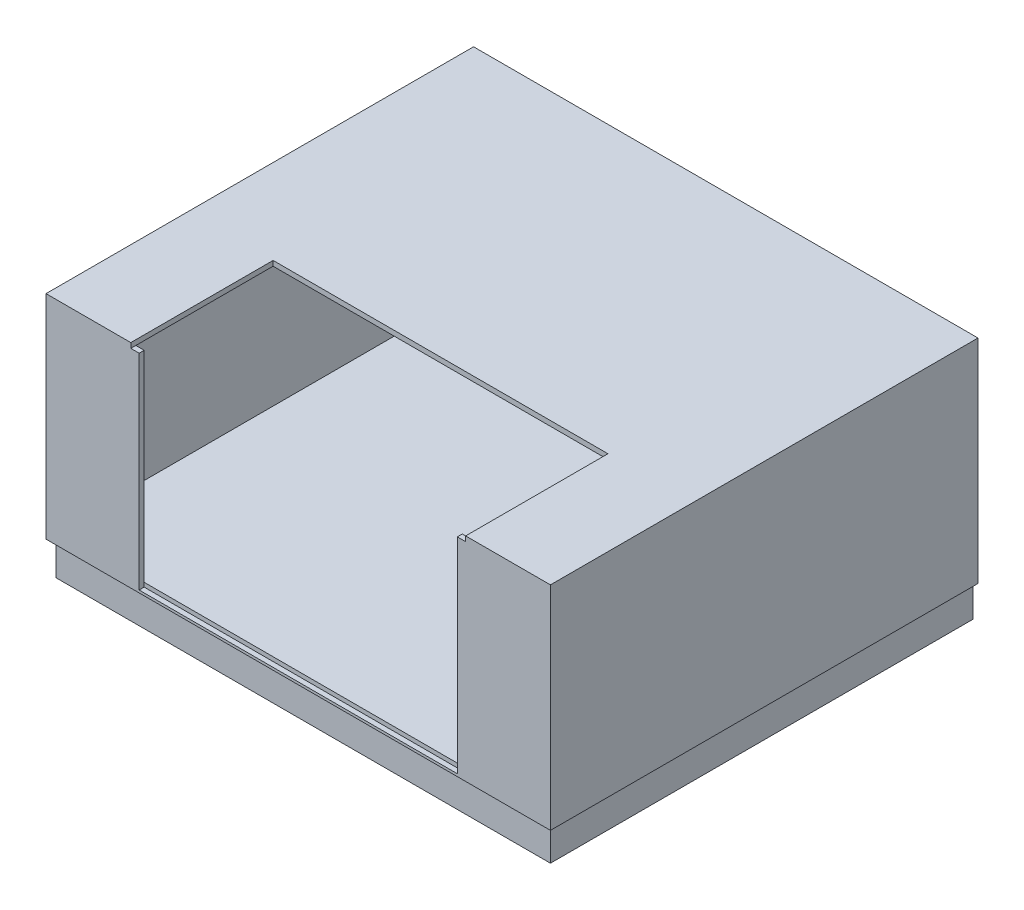
ISO-10303-21;
HEADER;
FILE_DESCRIPTION(('STEP AP214'),'2;1');
FILE_NAME('part.step','',(''),(''),'','','');
FILE_SCHEMA(('AUTOMOTIVE_DESIGN { 1 0 10303 214 1 1 1 1 }'));
ENDSEC;
DATA;
#1=APPLICATION_CONTEXT('core data for automotive mechanical design processes');
#2=APPLICATION_PROTOCOL_DEFINITION('international standard','automotive_design',2000,#1);
#3=PRODUCT_CONTEXT('',#1,'mechanical');
#4=PRODUCT('Part','Part','',(#3));
#5=PRODUCT_RELATED_PRODUCT_CATEGORY('part','',(#4));
#6=PRODUCT_DEFINITION_FORMATION('','',#4);
#7=PRODUCT_DEFINITION_CONTEXT('part definition',#1,'design');
#8=PRODUCT_DEFINITION('design','',#6,#7);
#9=PRODUCT_DEFINITION_SHAPE('','',#8);
#10=(LENGTH_UNIT() NAMED_UNIT(*) SI_UNIT(.MILLI.,.METRE.));
#11=(NAMED_UNIT(*) PLANE_ANGLE_UNIT() SI_UNIT($,.RADIAN.));
#12=(NAMED_UNIT(*) SI_UNIT($,.STERADIAN.) SOLID_ANGLE_UNIT());
#13=UNCERTAINTY_MEASURE_WITH_UNIT(LENGTH_MEASURE(1.E-05),#10,'distance_accuracy_value','');
#14=(GEOMETRIC_REPRESENTATION_CONTEXT(3) GLOBAL_UNCERTAINTY_ASSIGNED_CONTEXT((#13)) GLOBAL_UNIT_ASSIGNED_CONTEXT((#10,
#11,#12)) REPRESENTATION_CONTEXT('',''));
#15=CARTESIAN_POINT('',(0.,0.,0.));
#16=DIRECTION('',(0.,0.,1.));
#17=DIRECTION('',(1.,0.,0.));
#18=AXIS2_PLACEMENT_3D('',#15,#16,#17);
#19=CARTESIAN_POINT('',(0.,0.,0.));
#20=DIRECTION('',(0.,1.,0.));
#21=DIRECTION('',(0.,0.,1.));
#22=AXIS2_PLACEMENT_3D('',#19,#20,#21);
#23=PLANE('',#22);
#24=DIRECTION('',(0.,0.,-1.));
#25=VECTOR('',#24,1.);
#26=CARTESIAN_POINT('',(4.71276856657332,0.,573.910779329399));
#27=LINE('',#26,#25);
#28=CARTESIAN_POINT('',(4.71276856657332,0.,573.910779329399));
#29=VERTEX_POINT('',#28);
#30=CARTESIAN_POINT('',(4.71276856657335,0.,69.1490048236985));
#31=VERTEX_POINT('',#30);
#32=EDGE_CURVE('E50',#29,#31,#27,.T.);
#33=ORIENTED_EDGE('',*,*,#32,.F.);
#34=DIRECTION('',(-1.,0.,0.));
#35=VECTOR('',#34,1.);
#36=CARTESIAN_POINT('',(4.71276856657332,0.,573.910779329399));
#37=LINE('',#36,#35);
#38=CARTESIAN_POINT('',(595.287231433427,0.,573.910779329399));
#39=VERTEX_POINT('',#38);
#40=EDGE_CURVE('E54',#39,#29,#37,.T.);
#41=ORIENTED_EDGE('',*,*,#40,.F.);
#42=DIRECTION('',(0.,0.,1.));
#43=VECTOR('',#42,1.);
#44=CARTESIAN_POINT('',(595.287231433427,0.,573.910779329399));
#45=LINE('',#44,#43);
#46=CARTESIAN_POINT('',(595.287231433427,0.,69.1490048236985));
#47=VERTEX_POINT('',#46);
#48=EDGE_CURVE('E385',#47,#39,#45,.T.);
#49=ORIENTED_EDGE('',*,*,#48,.F.);
#50=DIRECTION('',(-1.,0.,0.));
#51=VECTOR('',#50,1.);
#52=CARTESIAN_POINT('',(-1.28723143342668,0.,69.1490048236985));
#53=LINE('',#52,#51);
#54=CARTESIAN_POINT('',(601.287231433427,0.,69.1490048236985));
#55=VERTEX_POINT('',#54);
#56=EDGE_CURVE('E361',#55,#47,#53,.T.);
#57=ORIENTED_EDGE('',*,*,#56,.F.);
#58=DIRECTION('',(0.,0.,-1.));
#59=VECTOR('',#58,1.);
#60=CARTESIAN_POINT('',(601.287231433427,0.,69.1490048236985));
#61=LINE('',#60,#59);
#62=CARTESIAN_POINT('',(601.287231433427,0.,579.910779329399));
#63=VERTEX_POINT('',#62);
#64=EDGE_CURVE('E358',#63,#55,#61,.T.);
#65=ORIENTED_EDGE('',*,*,#64,.F.);
#66=DIRECTION('',(1.,0.,0.));
#67=VECTOR('',#66,1.);
#68=CARTESIAN_POINT('',(-1.28723143342668,0.,579.910779329399));
#69=LINE('',#68,#67);
#70=CARTESIAN_POINT('',(-1.28723143342668,0.,579.910779329399));
#71=VERTEX_POINT('',#70);
#72=EDGE_CURVE('E301',#71,#63,#69,.T.);
#73=ORIENTED_EDGE('',*,*,#72,.F.);
#74=DIRECTION('',(0.,0.,1.));
#75=VECTOR('',#74,1.);
#76=CARTESIAN_POINT('',(-1.28723143342668,0.,69.1490048236985));
#77=LINE('',#76,#75);
#78=CARTESIAN_POINT('',(-1.28723143342668,0.,69.1490048236985));
#79=VERTEX_POINT('',#78);
#80=EDGE_CURVE('E350',#79,#71,#77,.T.);
#81=ORIENTED_EDGE('',*,*,#80,.F.);
#82=EDGE_CURVE('E360',#31,#79,#53,.T.);
#83=ORIENTED_EDGE('',*,*,#82,.F.);
#84=EDGE_LOOP('',(#33,#41,#49,#57,#65,#73,#81,#83));
#85=FACE_BOUND('',#84,.T.);
#86=ADVANCED_FACE('F35',(#85),#23,.F.);
#87=DIRECTION('',(0.,0.,-1.));
#88=VECTOR('',#87,1.);
#89=CARTESIAN_POINT('',(555.287231433427,0.,69.1490048236985));
#90=LINE('',#89,#88);
#91=CARTESIAN_POINT('',(555.287231433427,0.,533.910779329399));
#92=VERTEX_POINT('',#91);
#93=CARTESIAN_POINT('',(555.287231433427,0.,69.1490048236985));
#94=VERTEX_POINT('',#93);
#95=EDGE_CURVE('E389',#92,#94,#90,.T.);
#96=ORIENTED_EDGE('',*,*,#95,.F.);
#97=DIRECTION('',(1.,0.,0.));
#98=VECTOR('',#97,1.);
#99=CARTESIAN_POINT('',(555.287231433427,0.,533.910779329399));
#100=LINE('',#99,#98);
#101=CARTESIAN_POINT('',(44.7127685665733,0.,533.910779329399));
#102=VERTEX_POINT('',#101);
#103=EDGE_CURVE('E393',#102,#92,#100,.T.);
#104=ORIENTED_EDGE('',*,*,#103,.F.);
#105=DIRECTION('',(0.,0.,1.));
#106=VECTOR('',#105,1.);
#107=CARTESIAN_POINT('',(44.7127685665733,0.,533.910779329399));
#108=LINE('',#107,#106);
#109=CARTESIAN_POINT('',(44.7127685665734,0.,69.1490048236985));
#110=VERTEX_POINT('',#109);
#111=EDGE_CURVE('E419',#110,#102,#108,.T.);
#112=ORIENTED_EDGE('',*,*,#111,.F.);
#113=EDGE_CURVE('E363',#94,#110,#53,.T.);
#114=ORIENTED_EDGE('',*,*,#113,.F.);
#115=EDGE_LOOP('',(#96,#104,#112,#114));
#116=FACE_BOUND('',#115,.T.);
#117=ADVANCED_FACE('F450',(#116),#23,.F.);
#118=CARTESIAN_POINT('',(0.,0.,573.910779329399));
#119=DIRECTION('',(0.,0.,1.));
#120=DIRECTION('',(1.,0.,0.));
#121=AXIS2_PLACEMENT_3D('',#118,#119,#120);
#122=PLANE('',#121);
#123=DIRECTION('',(-1.,0.,0.));
#124=VECTOR('',#123,1.);
#125=CARTESIAN_POINT('',(0.,248.,573.910779329399));
#126=LINE('',#125,#124);
#127=CARTESIAN_POINT('',(110.,248.,573.910779329399));
#128=VERTEX_POINT('',#127);
#129=CARTESIAN_POINT('',(100.,248.,573.910779329399));
#130=VERTEX_POINT('',#129);
#131=EDGE_CURVE('E294',#128,#130,#126,.T.);
#132=ORIENTED_EDGE('',*,*,#131,.F.);
#133=DIRECTION('',(0.,1.,0.));
#134=VECTOR('',#133,1.);
#135=CARTESIAN_POINT('',(110.,248.,573.910779329399));
#136=LINE('',#135,#134);
#137=CARTESIAN_POINT('',(110.,8.00000000000001,573.910779329399));
#138=VERTEX_POINT('',#137);
#139=EDGE_CURVE('E241',#138,#128,#136,.T.);
#140=ORIENTED_EDGE('',*,*,#139,.F.);
#141=DIRECTION('',(1.,0.,0.));
#142=VECTOR('',#141,1.);
#143=CARTESIAN_POINT('',(-1.28723143342663,8.,573.910779329399));
#144=LINE('',#143,#142);
#145=CARTESIAN_POINT('',(4.71276856657335,8.,573.910779329399));
#146=VERTEX_POINT('',#145);
#147=EDGE_CURVE('E351',#146,#138,#144,.T.);
#148=ORIENTED_EDGE('',*,*,#147,.F.);
#149=DIRECTION('',(0.,-1.,0.));
#150=VECTOR('',#149,1.);
#151=CARTESIAN_POINT('',(4.71276856657338,248.,573.910779329399));
#152=LINE('',#151,#150);
#153=CARTESIAN_POINT('',(4.71276856657338,248.,573.910779329399));
#154=VERTEX_POINT('',#153);
#155=EDGE_CURVE('E347',#154,#146,#152,.T.);
#156=ORIENTED_EDGE('',*,*,#155,.F.);
#157=DIRECTION('',(1.,0.,0.));
#158=VECTOR('',#157,1.);
#159=CARTESIAN_POINT('',(-1.28723143342668,248.,573.910779329399));
#160=LINE('',#159,#158);
#161=EDGE_CURVE('E323',#154,#130,#160,.T.);
#162=ORIENTED_EDGE('',*,*,#161,.T.);
#163=EDGE_LOOP('',(#132,#140,#148,#156,#162));
#164=FACE_BOUND('',#163,.T.);
#165=ADVANCED_FACE('F456',(#164),#122,.F.);
#166=CARTESIAN_POINT('',(0.,248.,0.));
#167=DIRECTION('',(0.,1.,0.));
#168=DIRECTION('',(0.,0.,1.));
#169=AXIS2_PLACEMENT_3D('',#166,#167,#168);
#170=PLANE('',#169);
#171=DIRECTION('',(0.,0.,1.));
#172=VECTOR('',#171,1.);
#173=CARTESIAN_POINT('',(110.,248.,121.776949584267));
#174=LINE('',#173,#172);
#175=CARTESIAN_POINT('',(110.,248.,579.910779329399));
#176=VERTEX_POINT('',#175);
#177=EDGE_CURVE('E252',#128,#176,#174,.T.);
#178=ORIENTED_EDGE('',*,*,#177,.F.);
#179=ORIENTED_EDGE('',*,*,#131,.T.);
#180=DIRECTION('',(0.,0.,-1.));
#181=VECTOR('',#180,1.);
#182=CARTESIAN_POINT('',(100.,248.,579.910779329399));
#183=LINE('',#182,#181);
#184=CARTESIAN_POINT('',(100.,248.,579.910779329399));
#185=VERTEX_POINT('',#184);
#186=EDGE_CURVE('E269',#185,#130,#183,.T.);
#187=ORIENTED_EDGE('',*,*,#186,.F.);
#188=DIRECTION('',(-1.,0.,0.));
#189=VECTOR('',#188,1.);
#190=CARTESIAN_POINT('',(100.,248.,579.910779329399));
#191=LINE('',#190,#189);
#192=EDGE_CURVE('E272',#176,#185,#191,.T.);
#193=ORIENTED_EDGE('',*,*,#192,.F.);
#194=EDGE_LOOP('',(#178,#179,#187,#193));
#195=FACE_BOUND('',#194,.T.);
#196=ADVANCED_FACE('F507',(#195),#170,.T.);
#197=CARTESIAN_POINT('',(0.,8.,0.));
#198=DIRECTION('',(0.,1.,0.));
#199=DIRECTION('',(0.,0.,1.));
#200=AXIS2_PLACEMENT_3D('',#197,#198,#199);
#201=PLANE('',#200);
#202=ORIENTED_EDGE('',*,*,#147,.T.);
#203=DIRECTION('',(1.,0.,0.));
#204=VECTOR('',#203,1.);
#205=CARTESIAN_POINT('',(0.,8.,573.910779329399));
#206=LINE('',#205,#204);
#207=CARTESIAN_POINT('',(490.,8.00000000000001,573.910779329399));
#208=VERTEX_POINT('',#207);
#209=EDGE_CURVE('E261',#138,#208,#206,.T.);
#210=ORIENTED_EDGE('',*,*,#209,.T.);
#211=CARTESIAN_POINT('',(595.287231433427,8.,573.910779329399));
#212=VERTEX_POINT('',#211);
#213=EDGE_CURVE('E355',#208,#212,#144,.T.);
#214=ORIENTED_EDGE('',*,*,#213,.T.);
#215=DIRECTION('',(0.,0.,1.));
#216=VECTOR('',#215,1.);
#217=CARTESIAN_POINT('',(595.287231433427,8.,573.910779329399));
#218=LINE('',#217,#216);
#219=CARTESIAN_POINT('',(595.287231433427,8.,69.1490048236985));
#220=VERTEX_POINT('',#219);
#221=EDGE_CURVE('E322',#220,#212,#218,.T.);
#222=ORIENTED_EDGE('',*,*,#221,.F.);
#223=DIRECTION('',(-1.,0.,0.));
#224=VECTOR('',#223,1.);
#225=CARTESIAN_POINT('',(-1.28723143342668,8.,69.1490048236985));
#226=LINE('',#225,#224);
#227=CARTESIAN_POINT('',(4.71276856657331,8.,69.1490048236985));
#228=VERTEX_POINT('',#227);
#229=EDGE_CURVE('E354',#220,#228,#226,.T.);
#230=ORIENTED_EDGE('',*,*,#229,.T.);
#231=DIRECTION('',(0.,0.,-1.));
#232=VECTOR('',#231,1.);
#233=CARTESIAN_POINT('',(4.71276856657331,8.,69.1490048236985));
#234=LINE('',#233,#232);
#235=EDGE_CURVE('E338',#146,#228,#234,.T.);
#236=ORIENTED_EDGE('',*,*,#235,.F.);
#237=EDGE_LOOP('',(#202,#210,#214,#222,#230,#236));
#238=FACE_BOUND('',#237,.T.);
#239=ADVANCED_FACE('F459',(#238),#201,.T.);
#240=CARTESIAN_POINT('',(-1.28723143342668,8.,69.1490048236985));
#241=DIRECTION('',(1.,0.,0.));
#242=DIRECTION('',(0.,0.,-1.));
#243=AXIS2_PLACEMENT_3D('',#240,#241,#242);
#244=PLANE('',#243);
#245=ORIENTED_EDGE('',*,*,#80,.T.);
#246=DIRECTION('',(0.,-1.,0.));
#247=VECTOR('',#246,1.);
#248=CARTESIAN_POINT('',(-1.28723143342668,254.,579.910779329399));
#249=LINE('',#248,#247);
#250=CARTESIAN_POINT('',(-1.28723143342668,254.,579.910779329399));
#251=VERTEX_POINT('',#250);
#252=EDGE_CURVE('E298',#251,#71,#249,.T.);
#253=ORIENTED_EDGE('',*,*,#252,.F.);
#254=DIRECTION('',(0.,0.,1.));
#255=VECTOR('',#254,1.);
#256=CARTESIAN_POINT('',(-1.28723143342668,254.,69.1490048236985));
#257=LINE('',#256,#255);
#258=CARTESIAN_POINT('',(-1.28723143342668,254.,69.1490048236985));
#259=VERTEX_POINT('',#258);
#260=EDGE_CURVE('E312',#259,#251,#257,.T.);
#261=ORIENTED_EDGE('',*,*,#260,.F.);
#262=DIRECTION('',(0.,-1.,0.));
#263=VECTOR('',#262,1.);
#264=CARTESIAN_POINT('',(-1.28723143342668,8.,69.1490048236985));
#265=LINE('',#264,#263);
#266=EDGE_CURVE('E43',#259,#79,#265,.T.);
#267=ORIENTED_EDGE('',*,*,#266,.T.);
#268=EDGE_LOOP('',(#245,#253,#261,#267));
#269=FACE_BOUND('',#268,.T.);
#270=ADVANCED_FACE('F37',(#269),#244,.F.);
#271=CARTESIAN_POINT('',(601.287231433427,8.,69.1490048236985));
#272=DIRECTION('',(-1.,0.,0.));
#273=DIRECTION('',(0.,0.,1.));
#274=AXIS2_PLACEMENT_3D('',#271,#272,#273);
#275=PLANE('',#274);
#276=ORIENTED_EDGE('',*,*,#64,.T.);
#277=DIRECTION('',(0.,-1.,0.));
#278=VECTOR('',#277,1.);
#279=CARTESIAN_POINT('',(601.287231433427,8.,69.1490048236985));
#280=LINE('',#279,#278);
#281=CARTESIAN_POINT('',(601.287231433427,254.,69.1490048236985));
#282=VERTEX_POINT('',#281);
#283=EDGE_CURVE('E11',#282,#55,#280,.T.);
#284=ORIENTED_EDGE('',*,*,#283,.F.);
#285=DIRECTION('',(0.,0.,-1.));
#286=VECTOR('',#285,1.);
#287=CARTESIAN_POINT('',(601.287231433427,254.,69.1490048236985));
#288=LINE('',#287,#286);
#289=CARTESIAN_POINT('',(601.287231433427,254.,579.910779329399));
#290=VERTEX_POINT('',#289);
#291=EDGE_CURVE('E315',#290,#282,#288,.T.);
#292=ORIENTED_EDGE('',*,*,#291,.F.);
#293=DIRECTION('',(0.,1.,0.));
#294=VECTOR('',#293,1.);
#295=CARTESIAN_POINT('',(601.287231433427,254.,579.910779329399));
#296=LINE('',#295,#294);
#297=EDGE_CURVE('E304',#63,#290,#296,.T.);
#298=ORIENTED_EDGE('',*,*,#297,.F.);
#299=EDGE_LOOP('',(#276,#284,#292,#298));
#300=FACE_BOUND('',#299,.T.);
#301=ADVANCED_FACE('F463',(#300),#275,.F.);
#302=CARTESIAN_POINT('',(-1.28723143342668,8.,69.1490048236985));
#303=DIRECTION('',(0.,0.,1.));
#304=DIRECTION('',(1.,0.,0.));
#305=AXIS2_PLACEMENT_3D('',#302,#303,#304);
#306=PLANE('',#305);
#307=ORIENTED_EDGE('',*,*,#266,.F.);
#308=DIRECTION('',(-1.,0.,0.));
#309=VECTOR('',#308,1.);
#310=CARTESIAN_POINT('',(-1.28723143342668,254.,69.1490048236985));
#311=LINE('',#310,#309);
#312=EDGE_CURVE('E319',#282,#259,#311,.T.);
#313=ORIENTED_EDGE('',*,*,#312,.F.);
#314=ORIENTED_EDGE('',*,*,#283,.T.);
#315=ORIENTED_EDGE('',*,*,#56,.T.);
#316=DIRECTION('',(0.,1.,0.));
#317=VECTOR('',#316,1.);
#318=CARTESIAN_POINT('',(595.287231433427,-40.,69.1490048236985));
#319=LINE('',#318,#317);
#320=CARTESIAN_POINT('',(595.287231433427,-40.,69.1490048236985));
#321=VERTEX_POINT('',#320);
#322=EDGE_CURVE('E401',#321,#47,#319,.T.);
#323=ORIENTED_EDGE('',*,*,#322,.F.);
#324=DIRECTION('',(1.,0.,0.));
#325=VECTOR('',#324,1.);
#326=CARTESIAN_POINT('',(595.287231433427,-40.,69.1490048236985));
#327=LINE('',#326,#325);
#328=CARTESIAN_POINT('',(555.287231433427,-40.,69.1490048236985));
#329=VERTEX_POINT('',#328);
#330=EDGE_CURVE('E427',#329,#321,#327,.T.);
#331=ORIENTED_EDGE('',*,*,#330,.F.);
#332=DIRECTION('',(0.,1.,0.));
#333=VECTOR('',#332,1.);
#334=CARTESIAN_POINT('',(555.287231433427,-40.,69.1490048236985));
#335=LINE('',#334,#333);
#336=EDGE_CURVE('E403',#329,#94,#335,.T.);
#337=ORIENTED_EDGE('',*,*,#336,.T.);
#338=ORIENTED_EDGE('',*,*,#113,.T.);
#339=DIRECTION('',(0.,1.,0.));
#340=VECTOR('',#339,1.);
#341=CARTESIAN_POINT('',(44.7127685665734,-40.,69.1490048236985));
#342=LINE('',#341,#340);
#343=CARTESIAN_POINT('',(44.7127685665734,-40.,69.1490048236985));
#344=VERTEX_POINT('',#343);
#345=EDGE_CURVE('E214',#344,#110,#342,.T.);
#346=ORIENTED_EDGE('',*,*,#345,.F.);
#347=DIRECTION('',(1.,0.,0.));
#348=VECTOR('',#347,1.);
#349=CARTESIAN_POINT('',(44.7127685665734,-40.,69.1490048236985));
#350=LINE('',#349,#348);
#351=CARTESIAN_POINT('',(4.71276856657338,-40.,69.1490048236985));
#352=VERTEX_POINT('',#351);
#353=EDGE_CURVE('E206',#352,#344,#350,.T.);
#354=ORIENTED_EDGE('',*,*,#353,.F.);
#355=DIRECTION('',(0.,1.,0.));
#356=VECTOR('',#355,1.);
#357=CARTESIAN_POINT('',(4.71276856657338,-40.,69.1490048236985));
#358=LINE('',#357,#356);
#359=EDGE_CURVE('E211',#352,#31,#358,.T.);
#360=ORIENTED_EDGE('',*,*,#359,.T.);
#361=ORIENTED_EDGE('',*,*,#82,.T.);
#362=EDGE_LOOP('',(#307,#313,#314,#315,#323,#331,#337,#338,#346,#354,#360,#361));
#363=FACE_BOUND('',#362,.T.);
#364=DIRECTION('',(-1.,0.,0.));
#365=VECTOR('',#364,1.);
#366=CARTESIAN_POINT('',(-1.28723143342668,248.,69.1490048236985));
#367=LINE('',#366,#365);
#368=CARTESIAN_POINT('',(595.287231433427,248.,69.1490048236985));
#369=VERTEX_POINT('',#368);
#370=CARTESIAN_POINT('',(4.71276856657331,248.,69.1490048236985));
#371=VERTEX_POINT('',#370);
#372=EDGE_CURVE('E316',#369,#371,#367,.T.);
#373=ORIENTED_EDGE('',*,*,#372,.T.);
#374=DIRECTION('',(0.,-1.,0.));
#375=VECTOR('',#374,1.);
#376=CARTESIAN_POINT('',(4.71276856657331,248.,69.1490048236985));
#377=LINE('',#376,#375);
#378=EDGE_CURVE('E342',#371,#228,#377,.T.);
#379=ORIENTED_EDGE('',*,*,#378,.T.);
#380=ORIENTED_EDGE('',*,*,#229,.F.);
#381=DIRECTION('',(0.,-1.,0.));
#382=VECTOR('',#381,1.);
#383=CARTESIAN_POINT('',(595.287231433427,248.,69.1490048236985));
#384=LINE('',#383,#382);
#385=EDGE_CURVE('E336',#369,#220,#384,.T.);
#386=ORIENTED_EDGE('',*,*,#385,.F.);
#387=EDGE_LOOP('',(#373,#379,#380,#386));
#388=FACE_BOUND('',#387,.T.);
#389=ADVANCED_FACE('F208',(#363,#388),#306,.F.);
#390=CARTESIAN_POINT('',(4.71276856657331,248.,69.1490048236985));
#391=DIRECTION('',(-1.,0.,0.));
#392=DIRECTION('',(0.,0.,1.));
#393=AXIS2_PLACEMENT_3D('',#390,#391,#392);
#394=PLANE('',#393);
#395=ORIENTED_EDGE('',*,*,#235,.T.);
#396=ORIENTED_EDGE('',*,*,#378,.F.);
#397=DIRECTION('',(0.,0.,-1.));
#398=VECTOR('',#397,1.);
#399=CARTESIAN_POINT('',(4.71276856657331,248.,69.1490048236985));
#400=LINE('',#399,#398);
#401=EDGE_CURVE('E339',#154,#371,#400,.T.);
#402=ORIENTED_EDGE('',*,*,#401,.F.);
#403=ORIENTED_EDGE('',*,*,#155,.T.);
#404=EDGE_LOOP('',(#395,#396,#402,#403));
#405=FACE_BOUND('',#404,.T.);
#406=ADVANCED_FACE('F462',(#405),#394,.F.);
#407=CARTESIAN_POINT('',(595.287231433427,248.,573.910779329399));
#408=DIRECTION('',(1.,0.,0.));
#409=DIRECTION('',(0.,0.,-1.));
#410=AXIS2_PLACEMENT_3D('',#407,#408,#409);
#411=PLANE('',#410);
#412=ORIENTED_EDGE('',*,*,#221,.T.);
#413=DIRECTION('',(0.,-1.,0.));
#414=VECTOR('',#413,1.);
#415=CARTESIAN_POINT('',(595.287231433427,248.,573.910779329399));
#416=LINE('',#415,#414);
#417=CARTESIAN_POINT('',(595.287231433427,248.,573.910779329399));
#418=VERTEX_POINT('',#417);
#419=EDGE_CURVE('E331',#418,#212,#416,.T.);
#420=ORIENTED_EDGE('',*,*,#419,.F.);
#421=DIRECTION('',(0.,0.,1.));
#422=VECTOR('',#421,1.);
#423=CARTESIAN_POINT('',(595.287231433427,248.,573.910779329399));
#424=LINE('',#423,#422);
#425=EDGE_CURVE('E328',#369,#418,#424,.T.);
#426=ORIENTED_EDGE('',*,*,#425,.F.);
#427=ORIENTED_EDGE('',*,*,#385,.T.);
#428=EDGE_LOOP('',(#412,#420,#426,#427));
#429=FACE_BOUND('',#428,.T.);
#430=ADVANCED_FACE('F536',(#429),#411,.F.);
#431=CARTESIAN_POINT('',(0.,248.,0.));
#432=DIRECTION('',(0.,1.,0.));
#433=DIRECTION('',(0.,0.,1.));
#434=AXIS2_PLACEMENT_3D('',#431,#432,#433);
#435=PLANE('',#434);
#436=DIRECTION('',(1.,0.,0.));
#437=VECTOR('',#436,1.);
#438=CARTESIAN_POINT('',(100.,248.,409.910779329399));
#439=LINE('',#438,#437);
#440=CARTESIAN_POINT('',(100.,248.,409.910779329399));
#441=VERTEX_POINT('',#440);
#442=CARTESIAN_POINT('',(500.,248.,409.910779329399));
#443=VERTEX_POINT('',#442);
#444=EDGE_CURVE('E265',#441,#443,#439,.T.);
#445=ORIENTED_EDGE('',*,*,#444,.F.);
#446=EDGE_CURVE('E267',#130,#441,#183,.T.);
#447=ORIENTED_EDGE('',*,*,#446,.F.);
#448=ORIENTED_EDGE('',*,*,#161,.F.);
#449=ORIENTED_EDGE('',*,*,#401,.T.);
#450=ORIENTED_EDGE('',*,*,#372,.F.);
#451=ORIENTED_EDGE('',*,*,#425,.T.);
#452=CARTESIAN_POINT('',(500.,248.,573.910779329399));
#453=VERTEX_POINT('',#452);
#454=EDGE_CURVE('E311',#453,#418,#160,.T.);
#455=ORIENTED_EDGE('',*,*,#454,.F.);
#456=DIRECTION('',(0.,0.,1.));
#457=VECTOR('',#456,1.);
#458=CARTESIAN_POINT('',(500.,248.,579.910779329399));
#459=LINE('',#458,#457);
#460=EDGE_CURVE('E292',#443,#453,#459,.T.);
#461=ORIENTED_EDGE('',*,*,#460,.F.);
#462=EDGE_LOOP('',(#445,#447,#448,#449,#450,#451,#455,#461));
#463=FACE_BOUND('',#462,.T.);
#464=ADVANCED_FACE('F515',(#463),#435,.F.);
#465=CARTESIAN_POINT('',(0.,254.,0.));
#466=DIRECTION('',(0.,1.,0.));
#467=DIRECTION('',(0.,0.,1.));
#468=AXIS2_PLACEMENT_3D('',#465,#466,#467);
#469=PLANE('',#468);
#470=DIRECTION('',(0.,0.,1.));
#471=VECTOR('',#470,1.);
#472=CARTESIAN_POINT('',(100.,254.,579.910779329399));
#473=LINE('',#472,#471);
#474=CARTESIAN_POINT('',(100.,254.,409.910779329399));
#475=VERTEX_POINT('',#474);
#476=CARTESIAN_POINT('',(100.,254.,579.910779329399));
#477=VERTEX_POINT('',#476);
#478=EDGE_CURVE('E282',#475,#477,#473,.T.);
#479=ORIENTED_EDGE('',*,*,#478,.F.);
#480=DIRECTION('',(-1.,0.,0.));
#481=VECTOR('',#480,1.);
#482=CARTESIAN_POINT('',(100.,254.,409.910779329399));
#483=LINE('',#482,#481);
#484=CARTESIAN_POINT('',(500.,254.,409.910779329399));
#485=VERTEX_POINT('',#484);
#486=EDGE_CURVE('E279',#485,#475,#483,.T.);
#487=ORIENTED_EDGE('',*,*,#486,.F.);
#488=DIRECTION('',(0.,0.,-1.));
#489=VECTOR('',#488,1.);
#490=CARTESIAN_POINT('',(500.,254.,579.910779329399));
#491=LINE('',#490,#489);
#492=CARTESIAN_POINT('',(500.,254.,579.910779329399));
#493=VERTEX_POINT('',#492);
#494=EDGE_CURVE('E264',#493,#485,#491,.T.);
#495=ORIENTED_EDGE('',*,*,#494,.F.);
#496=DIRECTION('',(-1.,0.,0.));
#497=VECTOR('',#496,1.);
#498=CARTESIAN_POINT('',(-1.28723143342668,254.,579.910779329399));
#499=LINE('',#498,#497);
#500=EDGE_CURVE('E308',#290,#493,#499,.T.);
#501=ORIENTED_EDGE('',*,*,#500,.F.);
#502=ORIENTED_EDGE('',*,*,#291,.T.);
#503=ORIENTED_EDGE('',*,*,#312,.T.);
#504=ORIENTED_EDGE('',*,*,#260,.T.);
#505=EDGE_CURVE('E307',#477,#251,#499,.T.);
#506=ORIENTED_EDGE('',*,*,#505,.F.);
#507=EDGE_LOOP('',(#479,#487,#495,#501,#502,#503,#504,#506));
#508=FACE_BOUND('',#507,.T.);
#509=ADVANCED_FACE('F380',(#508),#469,.T.);
#510=ORIENTED_EDGE('',*,*,#213,.F.);
#511=DIRECTION('',(0.,-1.,0.));
#512=VECTOR('',#511,1.);
#513=CARTESIAN_POINT('',(490.,248.,573.910779329399));
#514=LINE('',#513,#512);
#515=CARTESIAN_POINT('',(490.,248.,573.910779329399));
#516=VERTEX_POINT('',#515);
#517=EDGE_CURVE('E238',#516,#208,#514,.T.);
#518=ORIENTED_EDGE('',*,*,#517,.F.);
#519=EDGE_CURVE('E295',#453,#516,#126,.T.);
#520=ORIENTED_EDGE('',*,*,#519,.F.);
#521=ORIENTED_EDGE('',*,*,#454,.T.);
#522=ORIENTED_EDGE('',*,*,#419,.T.);
#523=EDGE_LOOP('',(#510,#518,#520,#521,#522));
#524=FACE_BOUND('',#523,.T.);
#525=ADVANCED_FACE('F488',(#524),#122,.F.);
#526=CARTESIAN_POINT('',(0.,0.,579.910779329399));
#527=DIRECTION('',(0.,0.,1.));
#528=DIRECTION('',(1.,0.,0.));
#529=AXIS2_PLACEMENT_3D('',#526,#527,#528);
#530=PLANE('',#529);
#531=DIRECTION('',(0.,-1.,0.));
#532=VECTOR('',#531,1.);
#533=CARTESIAN_POINT('',(110.,248.,579.910779329399));
#534=LINE('',#533,#532);
#535=CARTESIAN_POINT('',(110.,3.,579.910779329399));
#536=VERTEX_POINT('',#535);
#537=EDGE_CURVE('E229',#176,#536,#534,.T.);
#538=ORIENTED_EDGE('',*,*,#537,.F.);
#539=ORIENTED_EDGE('',*,*,#192,.T.);
#540=DIRECTION('',(0.,1.,0.));
#541=VECTOR('',#540,1.);
#542=CARTESIAN_POINT('',(100.,-186.626276242015,579.910779329399));
#543=LINE('',#542,#541);
#544=EDGE_CURVE('E268',#185,#477,#543,.T.);
#545=ORIENTED_EDGE('',*,*,#544,.T.);
#546=ORIENTED_EDGE('',*,*,#505,.T.);
#547=ORIENTED_EDGE('',*,*,#252,.T.);
#548=ORIENTED_EDGE('',*,*,#72,.T.);
#549=ORIENTED_EDGE('',*,*,#297,.T.);
#550=ORIENTED_EDGE('',*,*,#500,.T.);
#551=DIRECTION('',(0.,1.,0.));
#552=VECTOR('',#551,1.);
#553=CARTESIAN_POINT('',(500.,-186.626276242015,579.910779329399));
#554=LINE('',#553,#552);
#555=CARTESIAN_POINT('',(500.,248.,579.910779329399));
#556=VERTEX_POINT('',#555);
#557=EDGE_CURVE('E284',#556,#493,#554,.T.);
#558=ORIENTED_EDGE('',*,*,#557,.F.);
#559=CARTESIAN_POINT('',(490.,248.,579.910779329399));
#560=VERTEX_POINT('',#559);
#561=EDGE_CURVE('E273',#556,#560,#191,.T.);
#562=ORIENTED_EDGE('',*,*,#561,.T.);
#563=DIRECTION('',(0.,1.,0.));
#564=VECTOR('',#563,1.);
#565=CARTESIAN_POINT('',(490.,248.,579.910779329399));
#566=LINE('',#565,#564);
#567=CARTESIAN_POINT('',(490.,3.,579.910779329399));
#568=VERTEX_POINT('',#567);
#569=EDGE_CURVE('E249',#568,#560,#566,.T.);
#570=ORIENTED_EDGE('',*,*,#569,.F.);
#571=DIRECTION('',(1.,0.,0.));
#572=VECTOR('',#571,1.);
#573=CARTESIAN_POINT('',(110.,3.,579.910779329399));
#574=LINE('',#573,#572);
#575=EDGE_CURVE('E232',#536,#568,#574,.T.);
#576=ORIENTED_EDGE('',*,*,#575,.F.);
#577=EDGE_LOOP('',(#538,#539,#545,#546,#547,#548,#549,#550,#558,#562,#570,#576));
#578=FACE_BOUND('',#577,.T.);
#579=ADVANCED_FACE('F375',(#578),#530,.T.);
#580=DIRECTION('',(0.,0.,1.));
#581=VECTOR('',#580,1.);
#582=CARTESIAN_POINT('',(490.,248.,121.776949584267));
#583=LINE('',#582,#581);
#584=EDGE_CURVE('E254',#516,#560,#583,.T.);
#585=ORIENTED_EDGE('',*,*,#584,.T.);
#586=ORIENTED_EDGE('',*,*,#561,.F.);
#587=EDGE_CURVE('E276',#453,#556,#459,.T.);
#588=ORIENTED_EDGE('',*,*,#587,.F.);
#589=ORIENTED_EDGE('',*,*,#519,.T.);
#590=EDGE_LOOP('',(#585,#586,#588,#589));
#591=FACE_BOUND('',#590,.T.);
#592=ADVANCED_FACE('F480',(#591),#170,.T.);
#593=CARTESIAN_POINT('',(100.,-186.626276242015,579.910779329399));
#594=DIRECTION('',(-1.,0.,0.));
#595=DIRECTION('',(0.,0.,1.));
#596=AXIS2_PLACEMENT_3D('',#593,#594,#595);
#597=PLANE('',#596);
#598=ORIENTED_EDGE('',*,*,#186,.T.);
#599=ORIENTED_EDGE('',*,*,#446,.T.);
#600=DIRECTION('',(0.,1.,0.));
#601=VECTOR('',#600,1.);
#602=CARTESIAN_POINT('',(100.,-186.626276242015,409.910779329399));
#603=LINE('',#602,#601);
#604=EDGE_CURVE('E287',#441,#475,#603,.T.);
#605=ORIENTED_EDGE('',*,*,#604,.T.);
#606=ORIENTED_EDGE('',*,*,#478,.T.);
#607=ORIENTED_EDGE('',*,*,#544,.F.);
#608=EDGE_LOOP('',(#598,#599,#605,#606,#607));
#609=FACE_BOUND('',#608,.T.);
#610=ADVANCED_FACE('F511',(#609),#597,.F.);
#611=CARTESIAN_POINT('',(100.,-186.626276242015,409.910779329399));
#612=DIRECTION('',(0.,0.,-1.));
#613=DIRECTION('',(-1.,0.,0.));
#614=AXIS2_PLACEMENT_3D('',#611,#612,#613);
#615=PLANE('',#614);
#616=ORIENTED_EDGE('',*,*,#444,.T.);
#617=DIRECTION('',(0.,1.,0.));
#618=VECTOR('',#617,1.);
#619=CARTESIAN_POINT('',(500.,-186.626276242015,409.910779329399));
#620=LINE('',#619,#618);
#621=EDGE_CURVE('E289',#443,#485,#620,.T.);
#622=ORIENTED_EDGE('',*,*,#621,.T.);
#623=ORIENTED_EDGE('',*,*,#486,.T.);
#624=ORIENTED_EDGE('',*,*,#604,.F.);
#625=EDGE_LOOP('',(#616,#622,#623,#624));
#626=FACE_BOUND('',#625,.T.);
#627=ADVANCED_FACE('F517',(#626),#615,.F.);
#628=CARTESIAN_POINT('',(500.,-186.626276242015,579.910779329399));
#629=DIRECTION('',(1.,0.,0.));
#630=DIRECTION('',(0.,0.,-1.));
#631=AXIS2_PLACEMENT_3D('',#628,#629,#630);
#632=PLANE('',#631);
#633=ORIENTED_EDGE('',*,*,#460,.T.);
#634=ORIENTED_EDGE('',*,*,#587,.T.);
#635=ORIENTED_EDGE('',*,*,#557,.T.);
#636=ORIENTED_EDGE('',*,*,#494,.T.);
#637=ORIENTED_EDGE('',*,*,#621,.F.);
#638=EDGE_LOOP('',(#633,#634,#635,#636,#637));
#639=FACE_BOUND('',#638,.T.);
#640=ADVANCED_FACE('F473',(#639),#632,.F.);
#641=CARTESIAN_POINT('',(110.,248.,121.776949584267));
#642=DIRECTION('',(-1.,0.,0.));
#643=DIRECTION('',(0.,-1.,0.));
#644=AXIS2_PLACEMENT_3D('',#641,#642,#643);
#645=PLANE('',#644);
#646=CARTESIAN_POINT('',(110.,3.,573.910779329399));
#647=VERTEX_POINT('',#646);
#648=EDGE_CURVE('E243',#647,#138,#136,.T.);
#649=ORIENTED_EDGE('',*,*,#648,.T.);
#650=ORIENTED_EDGE('',*,*,#139,.T.);
#651=ORIENTED_EDGE('',*,*,#177,.T.);
#652=ORIENTED_EDGE('',*,*,#537,.T.);
#653=DIRECTION('',(0.,0.,1.));
#654=VECTOR('',#653,1.);
#655=CARTESIAN_POINT('',(110.,3.,121.776949584267));
#656=LINE('',#655,#654);
#657=EDGE_CURVE('E251',#647,#536,#656,.T.);
#658=ORIENTED_EDGE('',*,*,#657,.F.);
#659=EDGE_LOOP('',(#649,#650,#651,#652,#658));
#660=FACE_BOUND('',#659,.T.);
#661=ADVANCED_FACE('F500',(#660),#645,.F.);
#662=CARTESIAN_POINT('',(490.,248.,121.776949584267));
#663=DIRECTION('',(1.,0.,0.));
#664=DIRECTION('',(0.,0.,-1.));
#665=AXIS2_PLACEMENT_3D('',#662,#663,#664);
#666=PLANE('',#665);
#667=ORIENTED_EDGE('',*,*,#517,.T.);
#668=CARTESIAN_POINT('',(490.,3.,573.910779329399));
#669=VERTEX_POINT('',#668);
#670=EDGE_CURVE('E242',#208,#669,#514,.T.);
#671=ORIENTED_EDGE('',*,*,#670,.T.);
#672=DIRECTION('',(0.,0.,1.));
#673=VECTOR('',#672,1.);
#674=CARTESIAN_POINT('',(490.,3.,121.776949584267));
#675=LINE('',#674,#673);
#676=EDGE_CURVE('E257',#669,#568,#675,.T.);
#677=ORIENTED_EDGE('',*,*,#676,.T.);
#678=ORIENTED_EDGE('',*,*,#569,.T.);
#679=ORIENTED_EDGE('',*,*,#584,.F.);
#680=EDGE_LOOP('',(#667,#671,#677,#678,#679));
#681=FACE_BOUND('',#680,.T.);
#682=ADVANCED_FACE('F485',(#681),#666,.F.);
#683=CARTESIAN_POINT('',(110.,3.,121.776949584267));
#684=DIRECTION('',(0.,-1.,0.));
#685=DIRECTION('',(0.,0.,-1.));
#686=AXIS2_PLACEMENT_3D('',#683,#684,#685);
#687=PLANE('',#686);
#688=DIRECTION('',(-1.,0.,0.));
#689=VECTOR('',#688,1.);
#690=CARTESIAN_POINT('',(110.,3.,573.910779329399));
#691=LINE('',#690,#689);
#692=EDGE_CURVE('E245',#669,#647,#691,.T.);
#693=ORIENTED_EDGE('',*,*,#692,.T.);
#694=ORIENTED_EDGE('',*,*,#657,.T.);
#695=ORIENTED_EDGE('',*,*,#575,.T.);
#696=ORIENTED_EDGE('',*,*,#676,.F.);
#697=EDGE_LOOP('',(#693,#694,#695,#696));
#698=FACE_BOUND('',#697,.T.);
#699=ADVANCED_FACE('F636',(#698),#687,.F.);
#700=CARTESIAN_POINT('',(0.,0.,573.910779329399));
#701=DIRECTION('',(0.,0.,1.));
#702=DIRECTION('',(1.,0.,0.));
#703=AXIS2_PLACEMENT_3D('',#700,#701,#702);
#704=PLANE('',#703);
#705=ORIENTED_EDGE('',*,*,#648,.F.);
#706=ORIENTED_EDGE('',*,*,#692,.F.);
#707=ORIENTED_EDGE('',*,*,#670,.F.);
#708=ORIENTED_EDGE('',*,*,#209,.F.);
#709=EDGE_LOOP('',(#705,#706,#707,#708));
#710=FACE_BOUND('',#709,.T.);
#711=ADVANCED_FACE('F495',(#710),#704,.T.);
#712=CARTESIAN_POINT('',(4.71276856657332,-40.,573.910779329399));
#713=DIRECTION('',(1.,0.,0.));
#714=DIRECTION('',(0.,0.,-1.));
#715=AXIS2_PLACEMENT_3D('',#712,#713,#714);
#716=PLANE('',#715);
#717=ORIENTED_EDGE('',*,*,#32,.T.);
#718=ORIENTED_EDGE('',*,*,#359,.F.);
#719=DIRECTION('',(0.,0.,-1.));
#720=VECTOR('',#719,1.);
#721=CARTESIAN_POINT('',(4.71276856657332,-40.,573.910779329399));
#722=LINE('',#721,#720);
#723=CARTESIAN_POINT('',(4.71276856657332,-40.,573.910779329399));
#724=VERTEX_POINT('',#723);
#725=EDGE_CURVE('E218',#724,#352,#722,.T.);
#726=ORIENTED_EDGE('',*,*,#725,.F.);
#727=DIRECTION('',(0.,1.,0.));
#728=VECTOR('',#727,1.);
#729=CARTESIAN_POINT('',(4.71276856657332,-40.,573.910779329399));
#730=LINE('',#729,#728);
#731=EDGE_CURVE('E397',#724,#29,#730,.T.);
#732=ORIENTED_EDGE('',*,*,#731,.T.);
#733=EDGE_LOOP('',(#717,#718,#726,#732));
#734=FACE_BOUND('',#733,.T.);
#735=ADVANCED_FACE('F228',(#734),#716,.F.);
#736=CARTESIAN_POINT('',(44.7127685665733,-40.,533.910779329399));
#737=DIRECTION('',(-1.,0.,0.));
#738=DIRECTION('',(0.,0.,1.));
#739=AXIS2_PLACEMENT_3D('',#736,#737,#738);
#740=PLANE('',#739);
#741=ORIENTED_EDGE('',*,*,#111,.T.);
#742=DIRECTION('',(0.,1.,0.));
#743=VECTOR('',#742,1.);
#744=CARTESIAN_POINT('',(44.7127685665733,-40.,533.910779329399));
#745=LINE('',#744,#743);
#746=CARTESIAN_POINT('',(44.7127685665733,-40.,533.910779329399));
#747=VERTEX_POINT('',#746);
#748=EDGE_CURVE('E234',#747,#102,#745,.T.);
#749=ORIENTED_EDGE('',*,*,#748,.F.);
#750=DIRECTION('',(0.,0.,1.));
#751=VECTOR('',#750,1.);
#752=CARTESIAN_POINT('',(44.7127685665733,-40.,533.910779329399));
#753=LINE('',#752,#751);
#754=EDGE_CURVE('E217',#344,#747,#753,.T.);
#755=ORIENTED_EDGE('',*,*,#754,.F.);
#756=ORIENTED_EDGE('',*,*,#345,.T.);
#757=EDGE_LOOP('',(#741,#749,#755,#756));
#758=FACE_BOUND('',#757,.T.);
#759=ADVANCED_FACE('F418',(#758),#740,.F.);
#760=CARTESIAN_POINT('',(555.287231433427,-40.,533.910779329399));
#761=DIRECTION('',(0.,0.,1.));
#762=DIRECTION('',(1.,0.,0.));
#763=AXIS2_PLACEMENT_3D('',#760,#761,#762);
#764=PLANE('',#763);
#765=ORIENTED_EDGE('',*,*,#103,.T.);
#766=DIRECTION('',(0.,1.,0.));
#767=VECTOR('',#766,1.);
#768=CARTESIAN_POINT('',(555.287231433427,-40.,533.910779329399));
#769=LINE('',#768,#767);
#770=CARTESIAN_POINT('',(555.287231433427,-40.,533.910779329399));
#771=VERTEX_POINT('',#770);
#772=EDGE_CURVE('E406',#771,#92,#769,.T.);
#773=ORIENTED_EDGE('',*,*,#772,.F.);
#774=DIRECTION('',(1.,0.,0.));
#775=VECTOR('',#774,1.);
#776=CARTESIAN_POINT('',(555.287231433427,-40.,533.910779329399));
#777=LINE('',#776,#775);
#778=EDGE_CURVE('E415',#747,#771,#777,.T.);
#779=ORIENTED_EDGE('',*,*,#778,.F.);
#780=ORIENTED_EDGE('',*,*,#748,.T.);
#781=EDGE_LOOP('',(#765,#773,#779,#780));
#782=FACE_BOUND('',#781,.T.);
#783=ADVANCED_FACE('F413',(#782),#764,.F.);
#784=CARTESIAN_POINT('',(555.287231433427,-40.,69.1490048236985));
#785=DIRECTION('',(1.,0.,0.));
#786=DIRECTION('',(0.,0.,-1.));
#787=AXIS2_PLACEMENT_3D('',#784,#785,#786);
#788=PLANE('',#787);
#789=ORIENTED_EDGE('',*,*,#95,.T.);
#790=ORIENTED_EDGE('',*,*,#336,.F.);
#791=DIRECTION('',(0.,0.,-1.));
#792=VECTOR('',#791,1.);
#793=CARTESIAN_POINT('',(555.287231433427,-40.,69.1490048236985));
#794=LINE('',#793,#792);
#795=EDGE_CURVE('E429',#771,#329,#794,.T.);
#796=ORIENTED_EDGE('',*,*,#795,.F.);
#797=ORIENTED_EDGE('',*,*,#772,.T.);
#798=EDGE_LOOP('',(#789,#790,#796,#797));
#799=FACE_BOUND('',#798,.T.);
#800=ADVANCED_FACE('F435',(#799),#788,.F.);
#801=CARTESIAN_POINT('',(595.287231433427,-40.,573.910779329399));
#802=DIRECTION('',(-1.,0.,0.));
#803=DIRECTION('',(0.,0.,1.));
#804=AXIS2_PLACEMENT_3D('',#801,#802,#803);
#805=PLANE('',#804);
#806=ORIENTED_EDGE('',*,*,#48,.T.);
#807=DIRECTION('',(0.,1.,0.));
#808=VECTOR('',#807,1.);
#809=CARTESIAN_POINT('',(595.287231433427,-40.,573.910779329399));
#810=LINE('',#809,#808);
#811=CARTESIAN_POINT('',(595.287231433427,-40.,573.910779329399));
#812=VERTEX_POINT('',#811);
#813=EDGE_CURVE('E399',#812,#39,#810,.T.);
#814=ORIENTED_EDGE('',*,*,#813,.F.);
#815=DIRECTION('',(0.,0.,1.));
#816=VECTOR('',#815,1.);
#817=CARTESIAN_POINT('',(595.287231433427,-40.,573.910779329399));
#818=LINE('',#817,#816);
#819=EDGE_CURVE('E425',#321,#812,#818,.T.);
#820=ORIENTED_EDGE('',*,*,#819,.F.);
#821=ORIENTED_EDGE('',*,*,#322,.T.);
#822=EDGE_LOOP('',(#806,#814,#820,#821));
#823=FACE_BOUND('',#822,.T.);
#824=ADVANCED_FACE('F438',(#823),#805,.F.);
#825=CARTESIAN_POINT('',(4.71276856657332,-40.,573.910779329399));
#826=DIRECTION('',(0.,0.,-1.));
#827=DIRECTION('',(-1.,0.,0.));
#828=AXIS2_PLACEMENT_3D('',#825,#826,#827);
#829=PLANE('',#828);
#830=ORIENTED_EDGE('',*,*,#40,.T.);
#831=ORIENTED_EDGE('',*,*,#731,.F.);
#832=DIRECTION('',(-1.,0.,0.));
#833=VECTOR('',#832,1.);
#834=CARTESIAN_POINT('',(4.71276856657332,-40.,573.910779329399));
#835=LINE('',#834,#833);
#836=EDGE_CURVE('E223',#812,#724,#835,.T.);
#837=ORIENTED_EDGE('',*,*,#836,.F.);
#838=ORIENTED_EDGE('',*,*,#813,.T.);
#839=EDGE_LOOP('',(#830,#831,#837,#838));
#840=FACE_BOUND('',#839,.T.);
#841=ADVANCED_FACE('F440',(#840),#829,.F.);
#842=CARTESIAN_POINT('',(0.,-40.,0.));
#843=DIRECTION('',(0.,1.,0.));
#844=DIRECTION('',(0.,0.,1.));
#845=AXIS2_PLACEMENT_3D('',#842,#843,#844);
#846=PLANE('',#845);
#847=ORIENTED_EDGE('',*,*,#725,.T.);
#848=ORIENTED_EDGE('',*,*,#353,.T.);
#849=ORIENTED_EDGE('',*,*,#754,.T.);
#850=ORIENTED_EDGE('',*,*,#778,.T.);
#851=ORIENTED_EDGE('',*,*,#795,.T.);
#852=ORIENTED_EDGE('',*,*,#330,.T.);
#853=ORIENTED_EDGE('',*,*,#819,.T.);
#854=ORIENTED_EDGE('',*,*,#836,.T.);
#855=EDGE_LOOP('',(#847,#848,#849,#850,#851,#852,#853,#854));
#856=FACE_BOUND('',#855,.T.);
#857=ADVANCED_FACE('F221',(#856),#846,.F.);
#858=CLOSED_SHELL('',(#86,#117,#165,#196,#239,#270,#301,#389,#406,#430,#464,#509,#525,#579,#592,
#610,#627,#640,#661,#682,#699,#711,#735,#759,#783,#800,#824,#841,#857));
#859=MANIFOLD_SOLID_BREP('B2',#858);
#860=ADVANCED_BREP_SHAPE_REPRESENTATION('',(#18,#859),#14);
#861=SHAPE_DEFINITION_REPRESENTATION(#9,#860);
ENDSEC;
END-ISO-10303-21;
